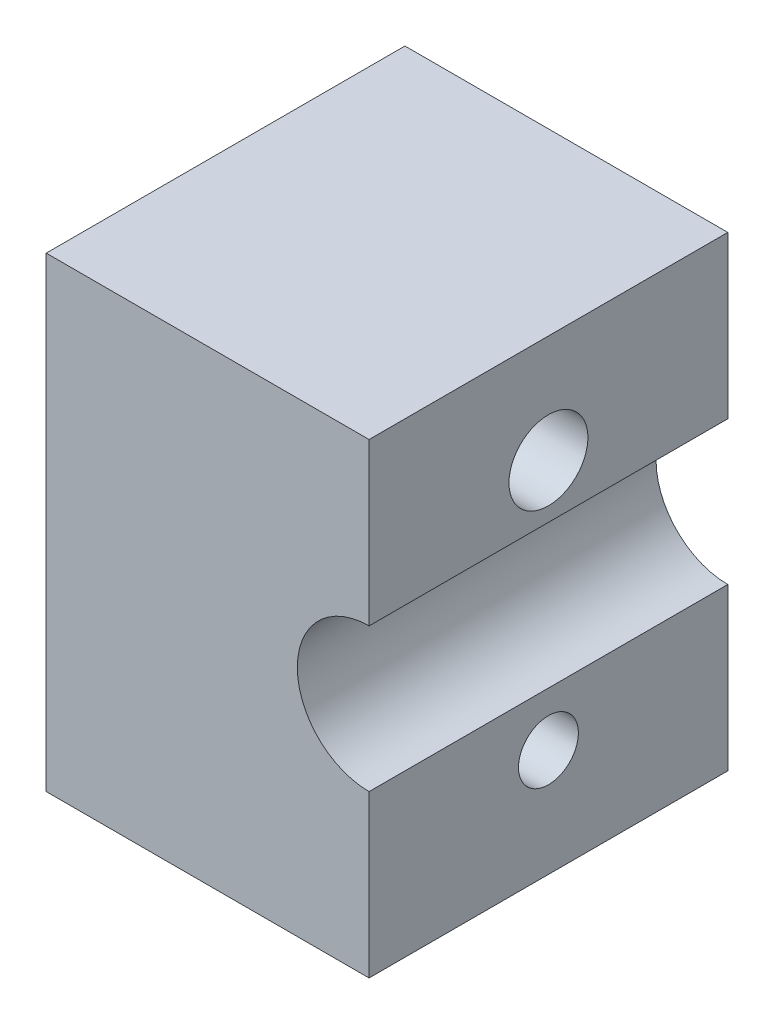
ISO-10303-21;
HEADER;
FILE_DESCRIPTION(('STEP AP214'),'2;1');
FILE_NAME('part.step','',(''),(''),'','','');
FILE_SCHEMA(('AUTOMOTIVE_DESIGN { 1 0 10303 214 1 1 1 1 }'));
ENDSEC;
DATA;
#1=APPLICATION_CONTEXT('core data for automotive mechanical design processes');
#2=APPLICATION_PROTOCOL_DEFINITION('international standard','automotive_design',2000,#1);
#3=PRODUCT_CONTEXT('',#1,'mechanical');
#4=PRODUCT('Part','Part','',(#3));
#5=PRODUCT_RELATED_PRODUCT_CATEGORY('part','',(#4));
#6=PRODUCT_DEFINITION_FORMATION('','',#4);
#7=PRODUCT_DEFINITION_CONTEXT('part definition',#1,'design');
#8=PRODUCT_DEFINITION('design','',#6,#7);
#9=PRODUCT_DEFINITION_SHAPE('','',#8);
#10=(LENGTH_UNIT() NAMED_UNIT(*) SI_UNIT(.MILLI.,.METRE.));
#11=(NAMED_UNIT(*) PLANE_ANGLE_UNIT() SI_UNIT($,.RADIAN.));
#12=(NAMED_UNIT(*) SI_UNIT($,.STERADIAN.) SOLID_ANGLE_UNIT());
#13=UNCERTAINTY_MEASURE_WITH_UNIT(LENGTH_MEASURE(1.E-05),#10,'distance_accuracy_value','');
#14=(GEOMETRIC_REPRESENTATION_CONTEXT(3) GLOBAL_UNCERTAINTY_ASSIGNED_CONTEXT((#13)) GLOBAL_UNIT_ASSIGNED_CONTEXT((#10,
#11,#12)) REPRESENTATION_CONTEXT('',''));
#15=CARTESIAN_POINT('',(0.,0.,0.));
#16=DIRECTION('',(0.,0.,1.));
#17=DIRECTION('',(1.,0.,0.));
#18=AXIS2_PLACEMENT_3D('',#15,#16,#17);
#19=CARTESIAN_POINT('',(-29.,-13.,18.));
#20=DIRECTION('',(0.,0.,1.));
#21=DIRECTION('',(1.,0.,0.));
#22=AXIS2_PLACEMENT_3D('',#19,#20,#21);
#23=PLANE('',#22);
#24=DIRECTION('',(0.,1.,0.));
#25=VECTOR('',#24,1.);
#26=CARTESIAN_POINT('',(-29.,-13.,18.));
#27=LINE('',#26,#25);
#28=CARTESIAN_POINT('',(-29.,-13.,18.));
#29=VERTEX_POINT('',#28);
#30=CARTESIAN_POINT('',(-29.,-4.00000000000001,18.));
#31=VERTEX_POINT('',#30);
#32=EDGE_CURVE('E97',#29,#31,#27,.T.);
#33=ORIENTED_EDGE('',*,*,#32,.T.);
#34=CARTESIAN_POINT('',(-29.,0.,18.));
#35=DIRECTION('',(0.,0.,-1.));
#36=DIRECTION('',(-1.,0.,0.));
#37=AXIS2_PLACEMENT_3D('',#34,#35,#36);
#38=CIRCLE('',#37,4.);
#39=CARTESIAN_POINT('',(-29.,4.,18.));
#40=VERTEX_POINT('',#39);
#41=EDGE_CURVE('E45',#31,#40,#38,.T.);
#42=ORIENTED_EDGE('',*,*,#41,.T.);
#43=CARTESIAN_POINT('',(-29.,13.,18.));
#44=VERTEX_POINT('',#43);
#45=EDGE_CURVE('E95',#40,#44,#27,.T.);
#46=ORIENTED_EDGE('',*,*,#45,.T.);
#47=DIRECTION('',(-1.,0.,0.));
#48=VECTOR('',#47,1.);
#49=CARTESIAN_POINT('',(-29.,13.,18.));
#50=LINE('',#49,#48);
#51=CARTESIAN_POINT('',(-47.,13.,18.));
#52=VERTEX_POINT('',#51);
#53=EDGE_CURVE('E129',#44,#52,#50,.T.);
#54=ORIENTED_EDGE('',*,*,#53,.T.);
#55=DIRECTION('',(0.,1.,0.));
#56=VECTOR('',#55,1.);
#57=CARTESIAN_POINT('',(-47.,-13.,18.));
#58=LINE('',#57,#56);
#59=CARTESIAN_POINT('',(-47.,-13.,18.));
#60=VERTEX_POINT('',#59);
#61=EDGE_CURVE('E117',#60,#52,#58,.T.);
#62=ORIENTED_EDGE('',*,*,#61,.F.);
#63=DIRECTION('',(-1.,0.,0.));
#64=VECTOR('',#63,1.);
#65=CARTESIAN_POINT('',(-29.,-13.,18.));
#66=LINE('',#65,#64);
#67=EDGE_CURVE('E80',#29,#60,#66,.T.);
#68=ORIENTED_EDGE('',*,*,#67,.F.);
#69=EDGE_LOOP('',(#33,#42,#46,#54,#62,#68));
#70=FACE_BOUND('',#69,.T.);
#71=ADVANCED_FACE('F30',(#70),#23,.T.);
#72=CARTESIAN_POINT('',(-29.,-13.,18.));
#73=DIRECTION('',(-1.,0.,0.));
#74=DIRECTION('',(0.,0.,1.));
#75=AXIS2_PLACEMENT_3D('',#72,#73,#74);
#76=PLANE('',#75);
#77=CARTESIAN_POINT('',(-29.,7.00000000000001,8.));
#78=DIRECTION('',(-1.,0.,0.));
#79=DIRECTION('',(0.,0.,1.));
#80=AXIS2_PLACEMENT_3D('',#77,#78,#79);
#81=CIRCLE('',#80,2.20000000000001);
#82=CARTESIAN_POINT('',(-29.,7.00000000000001,10.2));
#83=VERTEX_POINT('',#82);
#84=EDGE_CURVE('E118',#83,#83,#81,.T.);
#85=ORIENTED_EDGE('',*,*,#84,.T.);
#86=EDGE_LOOP('',(#85));
#87=FACE_BOUND('',#86,.T.);
#88=ORIENTED_EDGE('',*,*,#45,.F.);
#89=DIRECTION('',(0.,0.,-1.));
#90=VECTOR('',#89,1.);
#91=CARTESIAN_POINT('',(-29.,4.00000000000001,-2.));
#92=LINE('',#91,#90);
#93=CARTESIAN_POINT('',(-29.,4.00000000000001,-2.));
#94=VERTEX_POINT('',#93);
#95=EDGE_CURVE('E11',#40,#94,#92,.T.);
#96=ORIENTED_EDGE('',*,*,#95,.T.);
#97=DIRECTION('',(0.,-1.,0.));
#98=VECTOR('',#97,1.);
#99=CARTESIAN_POINT('',(-29.,13.,-2.));
#100=LINE('',#99,#98);
#101=CARTESIAN_POINT('',(-29.,13.,-2.));
#102=VERTEX_POINT('',#101);
#103=EDGE_CURVE('E112',#102,#94,#100,.T.);
#104=ORIENTED_EDGE('',*,*,#103,.F.);
#105=DIRECTION('',(0.,0.,-1.));
#106=VECTOR('',#105,1.);
#107=CARTESIAN_POINT('',(-29.,13.,18.));
#108=LINE('',#107,#106);
#109=EDGE_CURVE('E103',#44,#102,#108,.T.);
#110=ORIENTED_EDGE('',*,*,#109,.F.);
#111=EDGE_LOOP('',(#88,#96,#104,#110));
#112=FACE_BOUND('',#111,.T.);
#113=ADVANCED_FACE('F101',(#87,#112),#76,.F.);
#114=CARTESIAN_POINT('',(-29.,-13.,-2.));
#115=DIRECTION('',(0.,-1.,0.));
#116=DIRECTION('',(1.,0.,0.));
#117=AXIS2_PLACEMENT_3D('',#114,#115,#116);
#118=PLANE('',#117);
#119=DIRECTION('',(0.,0.,1.));
#120=VECTOR('',#119,1.);
#121=CARTESIAN_POINT('',(-47.,-13.,-2.));
#122=LINE('',#121,#120);
#123=CARTESIAN_POINT('',(-47.,-13.,-2.));
#124=VERTEX_POINT('',#123);
#125=EDGE_CURVE('E114',#124,#60,#122,.T.);
#126=ORIENTED_EDGE('',*,*,#125,.F.);
#127=DIRECTION('',(-1.,0.,0.));
#128=VECTOR('',#127,1.);
#129=CARTESIAN_POINT('',(-29.,-13.,-2.));
#130=LINE('',#129,#128);
#131=CARTESIAN_POINT('',(-29.,-13.,-2.));
#132=VERTEX_POINT('',#131);
#133=EDGE_CURVE('E73',#132,#124,#130,.T.);
#134=ORIENTED_EDGE('',*,*,#133,.F.);
#135=DIRECTION('',(0.,0.,1.));
#136=VECTOR('',#135,1.);
#137=CARTESIAN_POINT('',(-29.,-13.,-2.));
#138=LINE('',#137,#136);
#139=EDGE_CURVE('E104',#132,#29,#138,.T.);
#140=ORIENTED_EDGE('',*,*,#139,.T.);
#141=ORIENTED_EDGE('',*,*,#67,.T.);
#142=EDGE_LOOP('',(#126,#134,#140,#141));
#143=FACE_BOUND('',#142,.T.);
#144=ADVANCED_FACE('F32',(#143),#118,.T.);
#145=CARTESIAN_POINT('',(-29.,13.,-2.));
#146=DIRECTION('',(0.,0.,-1.));
#147=DIRECTION('',(-1.,0.,0.));
#148=AXIS2_PLACEMENT_3D('',#145,#146,#147);
#149=PLANE('',#148);
#150=CARTESIAN_POINT('',(-29.,0.,-2.));
#151=DIRECTION('',(0.,0.,-1.));
#152=DIRECTION('',(-1.,0.,0.));
#153=AXIS2_PLACEMENT_3D('',#150,#151,#152);
#154=CIRCLE('',#153,4.00000000000001);
#155=CARTESIAN_POINT('',(-29.,-4.00000000000001,-2.));
#156=VERTEX_POINT('',#155);
#157=EDGE_CURVE('E90',#156,#94,#154,.T.);
#158=ORIENTED_EDGE('',*,*,#157,.F.);
#159=EDGE_CURVE('E54',#156,#132,#100,.T.);
#160=ORIENTED_EDGE('',*,*,#159,.T.);
#161=ORIENTED_EDGE('',*,*,#133,.T.);
#162=DIRECTION('',(0.,-1.,0.));
#163=VECTOR('',#162,1.);
#164=CARTESIAN_POINT('',(-47.,13.,-2.));
#165=LINE('',#164,#163);
#166=CARTESIAN_POINT('',(-47.,13.,-2.));
#167=VERTEX_POINT('',#166);
#168=EDGE_CURVE('E107',#167,#124,#165,.T.);
#169=ORIENTED_EDGE('',*,*,#168,.F.);
#170=DIRECTION('',(-1.,0.,0.));
#171=VECTOR('',#170,1.);
#172=CARTESIAN_POINT('',(-29.,13.,-2.));
#173=LINE('',#172,#171);
#174=EDGE_CURVE('E127',#102,#167,#173,.T.);
#175=ORIENTED_EDGE('',*,*,#174,.F.);
#176=ORIENTED_EDGE('',*,*,#103,.T.);
#177=EDGE_LOOP('',(#158,#160,#161,#169,#175,#176));
#178=FACE_BOUND('',#177,.T.);
#179=ADVANCED_FACE('F134',(#178),#149,.T.);
#180=CARTESIAN_POINT('',(-29.,13.,18.));
#181=DIRECTION('',(0.,1.,0.));
#182=DIRECTION('',(-1.,0.,0.));
#183=AXIS2_PLACEMENT_3D('',#180,#181,#182);
#184=PLANE('',#183);
#185=DIRECTION('',(0.,0.,-1.));
#186=VECTOR('',#185,1.);
#187=CARTESIAN_POINT('',(-47.,13.,18.));
#188=LINE('',#187,#186);
#189=EDGE_CURVE('E121',#52,#167,#188,.T.);
#190=ORIENTED_EDGE('',*,*,#189,.F.);
#191=ORIENTED_EDGE('',*,*,#53,.F.);
#192=ORIENTED_EDGE('',*,*,#109,.T.);
#193=ORIENTED_EDGE('',*,*,#174,.T.);
#194=EDGE_LOOP('',(#190,#191,#192,#193));
#195=FACE_BOUND('',#194,.T.);
#196=ADVANCED_FACE('F163',(#195),#184,.T.);
#197=CARTESIAN_POINT('',(-29.,-6.99999999999835,8.));
#198=DIRECTION('',(-1.,0.,0.));
#199=DIRECTION('',(0.,0.,1.));
#200=AXIS2_PLACEMENT_3D('',#197,#198,#199);
#201=CIRCLE('',#200,1.66919773996312);
#202=CARTESIAN_POINT('',(-29.,-6.99999999999835,9.66919773996313));
#203=VERTEX_POINT('',#202);
#204=EDGE_CURVE('E139',#203,#203,#201,.T.);
#205=ORIENTED_EDGE('',*,*,#204,.T.);
#206=EDGE_LOOP('',(#205));
#207=FACE_BOUND('',#206,.T.);
#208=ORIENTED_EDGE('',*,*,#159,.F.);
#209=DIRECTION('',(0.,0.,-1.));
#210=VECTOR('',#209,1.);
#211=CARTESIAN_POINT('',(-29.,-4.00000000000001,-2.));
#212=LINE('',#211,#210);
#213=EDGE_CURVE('E38',#156,#31,#212,.F.);
#214=ORIENTED_EDGE('',*,*,#213,.T.);
#215=ORIENTED_EDGE('',*,*,#32,.F.);
#216=ORIENTED_EDGE('',*,*,#139,.F.);
#217=EDGE_LOOP('',(#208,#214,#215,#216));
#218=FACE_BOUND('',#217,.T.);
#219=ADVANCED_FACE('F132',(#207,#218),#76,.F.);
#220=CARTESIAN_POINT('',(-47.,-13.,18.));
#221=DIRECTION('',(-1.,0.,0.));
#222=DIRECTION('',(0.,0.,1.));
#223=AXIS2_PLACEMENT_3D('',#220,#221,#222);
#224=PLANE('',#223);
#225=CARTESIAN_POINT('',(-47.,-6.99999999999835,8.));
#226=DIRECTION('',(-1.,0.,0.));
#227=DIRECTION('',(0.,0.,1.));
#228=AXIS2_PLACEMENT_3D('',#225,#226,#227);
#229=CIRCLE('',#228,1.66919773996313);
#230=CARTESIAN_POINT('',(-47.,-6.99999999999835,9.66919773996313));
#231=VERTEX_POINT('',#230);
#232=EDGE_CURVE('E98',#231,#231,#229,.T.);
#233=ORIENTED_EDGE('',*,*,#232,.F.);
#234=EDGE_LOOP('',(#233));
#235=FACE_BOUND('',#234,.T.);
#236=CARTESIAN_POINT('',(-47.,7.00000000000001,8.));
#237=DIRECTION('',(-1.,0.,0.));
#238=DIRECTION('',(0.,0.,1.));
#239=AXIS2_PLACEMENT_3D('',#236,#237,#238);
#240=CIRCLE('',#239,2.20000000000001);
#241=CARTESIAN_POINT('',(-47.,7.00000000000001,10.2));
#242=VERTEX_POINT('',#241);
#243=EDGE_CURVE('E142',#242,#242,#240,.T.);
#244=ORIENTED_EDGE('',*,*,#243,.F.);
#245=EDGE_LOOP('',(#244));
#246=FACE_BOUND('',#245,.T.);
#247=ORIENTED_EDGE('',*,*,#125,.T.);
#248=ORIENTED_EDGE('',*,*,#61,.T.);
#249=ORIENTED_EDGE('',*,*,#189,.T.);
#250=ORIENTED_EDGE('',*,*,#168,.T.);
#251=EDGE_LOOP('',(#247,#248,#249,#250));
#252=FACE_BOUND('',#251,.T.);
#253=ADVANCED_FACE('F152',(#235,#246,#252),#224,.T.);
#254=CARTESIAN_POINT('',(-47.,7.00000000000001,8.));
#255=DIRECTION('',(-1.,0.,0.));
#256=DIRECTION('',(0.,0.,1.));
#257=AXIS2_PLACEMENT_3D('',#254,#255,#256);
#258=CYLINDRICAL_SURFACE('',#257,2.20000000000001);
#259=ORIENTED_EDGE('',*,*,#84,.F.);
#260=EDGE_LOOP('',(#259));
#261=FACE_BOUND('',#260,.T.);
#262=ORIENTED_EDGE('',*,*,#243,.T.);
#263=EDGE_LOOP('',(#262));
#264=FACE_BOUND('',#263,.T.);
#265=ADVANCED_FACE('F148',(#261,#264),#258,.F.);
#266=CARTESIAN_POINT('',(-47.,-6.99999999999835,8.));
#267=DIRECTION('',(-1.,0.,0.));
#268=DIRECTION('',(0.,0.,1.));
#269=AXIS2_PLACEMENT_3D('',#266,#267,#268);
#270=CYLINDRICAL_SURFACE('',#269,1.66919773996313);
#271=ORIENTED_EDGE('',*,*,#204,.F.);
#272=EDGE_LOOP('',(#271));
#273=FACE_BOUND('',#272,.T.);
#274=ORIENTED_EDGE('',*,*,#232,.T.);
#275=EDGE_LOOP('',(#274));
#276=FACE_BOUND('',#275,.T.);
#277=ADVANCED_FACE('F151',(#273,#276),#270,.F.);
#278=CARTESIAN_POINT('',(-29.,0.,-2.));
#279=DIRECTION('',(0.,0.,-1.));
#280=DIRECTION('',(-1.,0.,0.));
#281=AXIS2_PLACEMENT_3D('',#278,#279,#280);
#282=CYLINDRICAL_SURFACE('',#281,4.00000000000001);
#283=ORIENTED_EDGE('',*,*,#41,.F.);
#284=ORIENTED_EDGE('',*,*,#213,.F.);
#285=ORIENTED_EDGE('',*,*,#157,.T.);
#286=ORIENTED_EDGE('',*,*,#95,.F.);
#287=EDGE_LOOP('',(#283,#284,#285,#286));
#288=FACE_BOUND('',#287,.T.);
#289=ADVANCED_FACE('F89',(#288),#282,.F.);
#290=CLOSED_SHELL('',(#71,#113,#144,#179,#196,#219,#253,#265,#277,#289));
#291=MANIFOLD_SOLID_BREP('B2',#290);
#292=ADVANCED_BREP_SHAPE_REPRESENTATION('',(#18,#291),#14);
#293=SHAPE_DEFINITION_REPRESENTATION(#9,#292);
ENDSEC;
END-ISO-10303-21;
